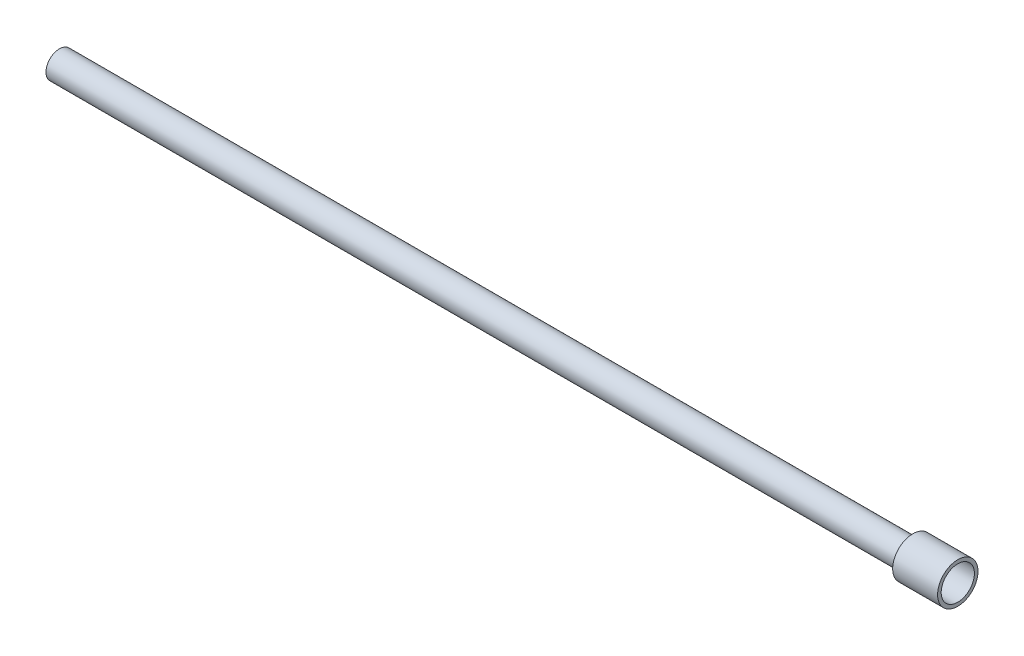
ISO-10303-21;
HEADER;
FILE_DESCRIPTION(('STEP AP214'),'2;1');
FILE_NAME('part.step','',(''),(''),'','','');
FILE_SCHEMA(('AUTOMOTIVE_DESIGN { 1 0 10303 214 1 1 1 1 }'));
ENDSEC;
DATA;
#1=APPLICATION_CONTEXT('core data for automotive mechanical design processes');
#2=APPLICATION_PROTOCOL_DEFINITION('international standard','automotive_design',2000,#1);
#3=PRODUCT_CONTEXT('',#1,'mechanical');
#4=PRODUCT('Part','Part','',(#3));
#5=PRODUCT_RELATED_PRODUCT_CATEGORY('part','',(#4));
#6=PRODUCT_DEFINITION_FORMATION('','',#4);
#7=PRODUCT_DEFINITION_CONTEXT('part definition',#1,'design');
#8=PRODUCT_DEFINITION('design','',#6,#7);
#9=PRODUCT_DEFINITION_SHAPE('','',#8);
#10=(LENGTH_UNIT() NAMED_UNIT(*) SI_UNIT(.MILLI.,.METRE.));
#11=(NAMED_UNIT(*) PLANE_ANGLE_UNIT() SI_UNIT($,.RADIAN.));
#12=(NAMED_UNIT(*) SI_UNIT($,.STERADIAN.) SOLID_ANGLE_UNIT());
#13=UNCERTAINTY_MEASURE_WITH_UNIT(LENGTH_MEASURE(1.E-05),#10,'distance_accuracy_value','');
#14=(GEOMETRIC_REPRESENTATION_CONTEXT(3) GLOBAL_UNCERTAINTY_ASSIGNED_CONTEXT((#13)) GLOBAL_UNIT_ASSIGNED_CONTEXT((#10,
#11,#12)) REPRESENTATION_CONTEXT('',''));
#15=CARTESIAN_POINT('',(0.,0.,0.));
#16=DIRECTION('',(0.,0.,1.));
#17=DIRECTION('',(1.,0.,0.));
#18=AXIS2_PLACEMENT_3D('',#15,#16,#17);
#19=CARTESIAN_POINT('',(5000.,0.,0.));
#20=DIRECTION('',(1.,0.,0.));
#21=DIRECTION('',(0.,0.,-1.));
#22=AXIS2_PLACEMENT_3D('',#19,#20,#21);
#23=PLANE('',#22);
#24=CARTESIAN_POINT('',(5000.,0.,0.));
#25=DIRECTION('',(1.,0.,0.));
#26=DIRECTION('',(0.,0.,-1.));
#27=AXIS2_PLACEMENT_3D('',#24,#25,#26);
#28=CIRCLE('',#27,112.5);
#29=CARTESIAN_POINT('',(5000.,0.,-112.5));
#30=VERTEX_POINT('',#29);
#31=EDGE_CURVE('E11',#30,#30,#28,.T.);
#32=ORIENTED_EDGE('',*,*,#31,.T.);
#33=EDGE_LOOP('',(#32));
#34=FACE_BOUND('',#33,.T.);
#35=CARTESIAN_POINT('',(5000.,0.,0.));
#36=DIRECTION('',(1.,0.,0.));
#37=DIRECTION('',(0.,0.,-1.));
#38=AXIS2_PLACEMENT_3D('',#35,#36,#37);
#39=CIRCLE('',#38,92.5);
#40=CARTESIAN_POINT('',(5000.,0.,-92.5));
#41=VERTEX_POINT('',#40);
#42=EDGE_CURVE('E60',#41,#41,#39,.T.);
#43=ORIENTED_EDGE('',*,*,#42,.F.);
#44=EDGE_LOOP('',(#43));
#45=FACE_BOUND('',#44,.T.);
#46=ADVANCED_FACE('F49',(#34,#45),#23,.T.);
#47=CARTESIAN_POINT('',(4750.,0.,0.));
#48=DIRECTION('',(1.,0.,0.));
#49=DIRECTION('',(0.,0.,-1.));
#50=AXIS2_PLACEMENT_3D('',#47,#48,#49);
#51=PLANE('',#50);
#52=CARTESIAN_POINT('',(4750.,0.,0.));
#53=DIRECTION('',(1.,0.,0.));
#54=DIRECTION('',(0.,0.,-1.));
#55=AXIS2_PLACEMENT_3D('',#52,#53,#54);
#56=CIRCLE('',#55,112.5);
#57=CARTESIAN_POINT('',(4750.,0.,-112.5));
#58=VERTEX_POINT('',#57);
#59=EDGE_CURVE('E53',#58,#58,#56,.T.);
#60=ORIENTED_EDGE('',*,*,#59,.F.);
#61=EDGE_LOOP('',(#60));
#62=FACE_BOUND('',#61,.T.);
#63=CARTESIAN_POINT('',(4750.,0.,0.));
#64=DIRECTION('',(1.,0.,0.));
#65=DIRECTION('',(0.,0.,-1.));
#66=AXIS2_PLACEMENT_3D('',#63,#64,#65);
#67=CIRCLE('',#66,92.5);
#68=CARTESIAN_POINT('',(4750.,0.,-92.5));
#69=VERTEX_POINT('',#68);
#70=EDGE_CURVE('E62',#69,#69,#67,.T.);
#71=ORIENTED_EDGE('',*,*,#70,.T.);
#72=EDGE_LOOP('',(#71));
#73=FACE_BOUND('',#72,.T.);
#74=ADVANCED_FACE('F72',(#62,#73),#51,.F.);
#75=CARTESIAN_POINT('',(5000.,0.,0.));
#76=DIRECTION('',(-1.,0.,0.));
#77=DIRECTION('',(0.,0.,1.));
#78=AXIS2_PLACEMENT_3D('',#75,#76,#77);
#79=CYLINDRICAL_SURFACE('',#78,112.5);
#80=ORIENTED_EDGE('',*,*,#31,.F.);
#81=EDGE_LOOP('',(#80));
#82=FACE_BOUND('',#81,.T.);
#83=ORIENTED_EDGE('',*,*,#59,.T.);
#84=EDGE_LOOP('',(#83));
#85=FACE_BOUND('',#84,.T.);
#86=ADVANCED_FACE('F51',(#82,#85),#79,.T.);
#87=CARTESIAN_POINT('',(5000.,0.,0.));
#88=DIRECTION('',(-1.,0.,0.));
#89=DIRECTION('',(0.,0.,1.));
#90=AXIS2_PLACEMENT_3D('',#87,#88,#89);
#91=CYLINDRICAL_SURFACE('',#90,92.5);
#92=ORIENTED_EDGE('',*,*,#42,.T.);
#93=EDGE_LOOP('',(#92));
#94=FACE_BOUND('',#93,.T.);
#95=ORIENTED_EDGE('',*,*,#70,.F.);
#96=EDGE_LOOP('',(#95));
#97=FACE_BOUND('',#96,.T.);
#98=ADVANCED_FACE('F68',(#94,#97),#91,.F.);
#99=CLOSED_SHELL('',(#46,#74,#86,#98));
#100=MANIFOLD_SOLID_BREP('B2',#99);
#101=CARTESIAN_POINT('',(4750.,0.,0.));
#102=DIRECTION('',(1.,0.,0.));
#103=DIRECTION('',(0.,0.,-1.));
#104=AXIS2_PLACEMENT_3D('',#101,#102,#103);
#105=PLANE('',#104);
#106=CARTESIAN_POINT('',(4750.,0.,0.));
#107=DIRECTION('',(1.,0.,0.));
#108=DIRECTION('',(0.,0.,-1.));
#109=AXIS2_PLACEMENT_3D('',#106,#107,#108);
#110=CIRCLE('',#109,75.);
#111=CARTESIAN_POINT('',(4750.,0.,-75.));
#112=VERTEX_POINT('',#111);
#113=EDGE_CURVE('E48',#112,#112,#110,.T.);
#114=ORIENTED_EDGE('',*,*,#113,.T.);
#115=EDGE_LOOP('',(#114));
#116=FACE_BOUND('',#115,.T.);
#117=CARTESIAN_POINT('',(4750.,0.,0.));
#118=DIRECTION('',(1.,0.,0.));
#119=DIRECTION('',(0.,0.,-1.));
#120=AXIS2_PLACEMENT_3D('',#117,#118,#119);
#121=CIRCLE('',#120,37.5);
#122=CARTESIAN_POINT('',(4750.,0.,-37.5));
#123=VERTEX_POINT('',#122);
#124=EDGE_CURVE('E132',#123,#123,#121,.T.);
#125=ORIENTED_EDGE('',*,*,#124,.F.);
#126=EDGE_LOOP('',(#125));
#127=FACE_BOUND('',#126,.T.);
#128=ADVANCED_FACE('F119',(#116,#127),#105,.T.);
#129=CARTESIAN_POINT('',(0.,0.,0.));
#130=DIRECTION('',(1.,0.,0.));
#131=DIRECTION('',(0.,0.,-1.));
#132=AXIS2_PLACEMENT_3D('',#129,#130,#131);
#133=PLANE('',#132);
#134=CARTESIAN_POINT('',(0.,0.,0.));
#135=DIRECTION('',(1.,0.,0.));
#136=DIRECTION('',(0.,0.,-1.));
#137=AXIS2_PLACEMENT_3D('',#134,#135,#136);
#138=CIRCLE('',#137,75.);
#139=CARTESIAN_POINT('',(0.,0.,-75.));
#140=VERTEX_POINT('',#139);
#141=EDGE_CURVE('E123',#140,#140,#138,.T.);
#142=ORIENTED_EDGE('',*,*,#141,.F.);
#143=EDGE_LOOP('',(#142));
#144=FACE_BOUND('',#143,.T.);
#145=CARTESIAN_POINT('',(0.,0.,0.));
#146=DIRECTION('',(1.,0.,0.));
#147=DIRECTION('',(0.,0.,-1.));
#148=AXIS2_PLACEMENT_3D('',#145,#146,#147);
#149=CIRCLE('',#148,37.5);
#150=CARTESIAN_POINT('',(0.,0.,-37.5));
#151=VERTEX_POINT('',#150);
#152=EDGE_CURVE('E134',#151,#151,#149,.T.);
#153=ORIENTED_EDGE('',*,*,#152,.T.);
#154=EDGE_LOOP('',(#153));
#155=FACE_BOUND('',#154,.T.);
#156=ADVANCED_FACE('F146',(#144,#155),#133,.F.);
#157=CARTESIAN_POINT('',(4750.,0.,0.));
#158=DIRECTION('',(-1.,0.,0.));
#159=DIRECTION('',(0.,0.,1.));
#160=AXIS2_PLACEMENT_3D('',#157,#158,#159);
#161=CYLINDRICAL_SURFACE('',#160,75.);
#162=ORIENTED_EDGE('',*,*,#113,.F.);
#163=EDGE_LOOP('',(#162));
#164=FACE_BOUND('',#163,.T.);
#165=ORIENTED_EDGE('',*,*,#141,.T.);
#166=EDGE_LOOP('',(#165));
#167=FACE_BOUND('',#166,.T.);
#168=ADVANCED_FACE('F121',(#164,#167),#161,.T.);
#169=CARTESIAN_POINT('',(4750.,0.,0.));
#170=DIRECTION('',(-1.,0.,0.));
#171=DIRECTION('',(0.,0.,1.));
#172=AXIS2_PLACEMENT_3D('',#169,#170,#171);
#173=CYLINDRICAL_SURFACE('',#172,37.5);
#174=ORIENTED_EDGE('',*,*,#124,.T.);
#175=EDGE_LOOP('',(#174));
#176=FACE_BOUND('',#175,.T.);
#177=ORIENTED_EDGE('',*,*,#152,.F.);
#178=EDGE_LOOP('',(#177));
#179=FACE_BOUND('',#178,.T.);
#180=ADVANCED_FACE('F142',(#176,#179),#173,.F.);
#181=CLOSED_SHELL('',(#128,#156,#168,#180));
#182=MANIFOLD_SOLID_BREP('B6',#181);
#183=ADVANCED_BREP_SHAPE_REPRESENTATION('',(#18,#100,#182),#14);
#184=SHAPE_DEFINITION_REPRESENTATION(#9,#183);
ENDSEC;
END-ISO-10303-21;
